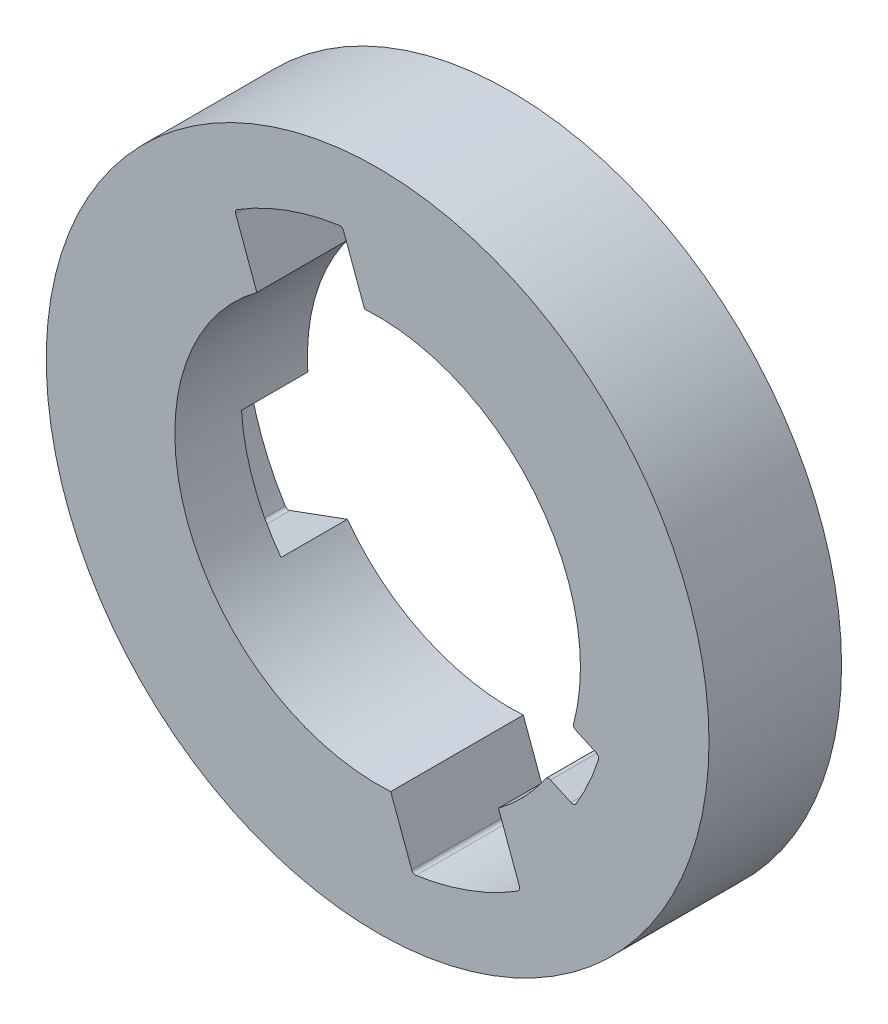
ISO-10303-21;
HEADER;
FILE_DESCRIPTION(('STEP AP214'),'2;1');
FILE_NAME('part.step','',(''),(''),'','','');
FILE_SCHEMA(('AUTOMOTIVE_DESIGN { 1 0 10303 214 1 1 1 1 }'));
ENDSEC;
DATA;
#1=APPLICATION_CONTEXT('core data for automotive mechanical design processes');
#2=APPLICATION_PROTOCOL_DEFINITION('international standard','automotive_design',2000,#1);
#3=PRODUCT_CONTEXT('',#1,'mechanical');
#4=PRODUCT('Part','Part','',(#3));
#5=PRODUCT_RELATED_PRODUCT_CATEGORY('part','',(#4));
#6=PRODUCT_DEFINITION_FORMATION('','',#4);
#7=PRODUCT_DEFINITION_CONTEXT('part definition',#1,'design');
#8=PRODUCT_DEFINITION('design','',#6,#7);
#9=PRODUCT_DEFINITION_SHAPE('','',#8);
#10=(LENGTH_UNIT() NAMED_UNIT(*) SI_UNIT(.MILLI.,.METRE.));
#11=(NAMED_UNIT(*) PLANE_ANGLE_UNIT() SI_UNIT($,.RADIAN.));
#12=(NAMED_UNIT(*) SI_UNIT($,.STERADIAN.) SOLID_ANGLE_UNIT());
#13=UNCERTAINTY_MEASURE_WITH_UNIT(LENGTH_MEASURE(1.E-05),#10,'distance_accuracy_value','');
#14=(GEOMETRIC_REPRESENTATION_CONTEXT(3) GLOBAL_UNCERTAINTY_ASSIGNED_CONTEXT((#13)) GLOBAL_UNIT_ASSIGNED_CONTEXT((#10,
#11,#12)) REPRESENTATION_CONTEXT('',''));
#15=CARTESIAN_POINT('',(0.,0.,0.));
#16=DIRECTION('',(0.,0.,1.));
#17=DIRECTION('',(1.,0.,0.));
#18=AXIS2_PLACEMENT_3D('',#15,#16,#17);
#19=CARTESIAN_POINT('',(0.,0.,10.));
#20=DIRECTION('',(0.,0.,-1.));
#21=DIRECTION('',(-1.,0.,0.));
#22=AXIS2_PLACEMENT_3D('',#19,#20,#21);
#23=CYLINDRICAL_SURFACE('',#22,15.3);
#24=DIRECTION('',(0.,0.,-1.));
#25=VECTOR('',#24,1.);
#26=CARTESIAN_POINT('',(12.2878994904702,9.11578444853222,5.));
#27=LINE('',#26,#25);
#28=CARTESIAN_POINT('',(12.2878994904702,9.11578444853222,5.));
#29=VERTEX_POINT('',#28);
#30=CARTESIAN_POINT('',(12.2878994904702,9.11578444853222,0.));
#31=VERTEX_POINT('',#30);
#32=EDGE_CURVE('E329',#29,#31,#27,.T.);
#33=ORIENTED_EDGE('',*,*,#32,.F.);
#34=CARTESIAN_POINT('',(0.,0.,5.));
#35=DIRECTION('',(0.,0.,1.));
#36=DIRECTION('',(1.,0.,0.));
#37=AXIS2_PLACEMENT_3D('',#34,#35,#36);
#38=CIRCLE('',#37,15.3);
#39=CARTESIAN_POINT('',(15.2681112245238,0.987309290734331,5.));
#40=VERTEX_POINT('',#39);
#41=EDGE_CURVE('E303',#29,#40,#38,.F.);
#42=ORIENTED_EDGE('',*,*,#41,.T.);
#43=DIRECTION('',(0.,0.,-1.));
#44=VECTOR('',#43,1.);
#45=CARTESIAN_POINT('',(15.2681112245238,0.987309290734331,5.));
#46=LINE('',#45,#44);
#47=CARTESIAN_POINT('',(15.2681112245238,0.987309290734331,0.));
#48=VERTEX_POINT('',#47);
#49=EDGE_CURVE('E326',#40,#48,#46,.T.);
#50=ORIENTED_EDGE('',*,*,#49,.T.);
#51=CARTESIAN_POINT('',(0.,0.,0.));
#52=DIRECTION('',(0.,0.,1.));
#53=DIRECTION('',(1.,0.,0.));
#54=AXIS2_PLACEMENT_3D('',#51,#52,#53);
#55=CIRCLE('',#54,15.3);
#56=CARTESIAN_POINT('',(14.7874090005765,-3.92715355565187,0.));
#57=VERTEX_POINT('',#56);
#58=EDGE_CURVE('E409',#48,#57,#55,.F.);
#59=ORIENTED_EDGE('',*,*,#58,.T.);
#60=DIRECTION('',(0.,0.,-1.));
#61=VECTOR('',#60,1.);
#62=CARTESIAN_POINT('',(14.7874090005765,-3.92715355565187,10.));
#63=LINE('',#62,#61);
#64=CARTESIAN_POINT('',(14.7874090005765,-3.92715355565187,10.));
#65=VERTEX_POINT('',#64);
#66=EDGE_CURVE('E474',#65,#57,#63,.T.);
#67=ORIENTED_EDGE('',*,*,#66,.F.);
#68=CARTESIAN_POINT('',(0.,0.,10.));
#69=DIRECTION('',(0.,0.,1.));
#70=DIRECTION('',(1.,0.,0.));
#71=AXIS2_PLACEMENT_3D('',#68,#69,#70);
#72=CIRCLE('',#71,15.3);
#73=CARTESIAN_POINT('',(-0.987309290714909,15.2681112245253,10.));
#74=VERTEX_POINT('',#73);
#75=EDGE_CURVE('E341',#74,#65,#72,.F.);
#76=ORIENTED_EDGE('',*,*,#75,.F.);
#77=DIRECTION('',(0.,0.,-1.));
#78=VECTOR('',#77,1.);
#79=CARTESIAN_POINT('',(-0.987309290714909,15.2681112245253,10.));
#80=LINE('',#79,#78);
#81=CARTESIAN_POINT('',(-0.987309290714909,15.2681112245253,0.));
#82=VERTEX_POINT('',#81);
#83=EDGE_CURVE('E477',#74,#82,#80,.T.);
#84=ORIENTED_EDGE('',*,*,#83,.T.);
#85=EDGE_CURVE('E395',#82,#31,#55,.F.);
#86=ORIENTED_EDGE('',*,*,#85,.T.);
#87=EDGE_LOOP('',(#33,#42,#50,#59,#67,#76,#84,#86));
#88=FACE_BOUND('',#87,.T.);
#89=ADVANCED_FACE('F35',(#88),#23,.F.);
#90=CARTESIAN_POINT('',(0.,0.,0.));
#91=DIRECTION('',(0.,0.,1.));
#92=DIRECTION('',(1.,0.,0.));
#93=AXIS2_PLACEMENT_3D('',#90,#91,#92);
#94=PLANE('',#93);
#95=CARTESIAN_POINT('',(0.,0.,0.));
#96=DIRECTION('',(0.,0.,1.));
#97=DIRECTION('',(1.,0.,0.));
#98=AXIS2_PLACEMENT_3D('',#95,#96,#97);
#99=CIRCLE('',#98,25.);
#100=CARTESIAN_POINT('',(25.,0.,0.));
#101=VERTEX_POINT('',#100);
#102=EDGE_CURVE('E339',#101,#101,#99,.T.);
#103=ORIENTED_EDGE('',*,*,#102,.F.);
#104=EDGE_LOOP('',(#103));
#105=FACE_BOUND('',#104,.T.);
#106=CARTESIAN_POINT('',(-15.2681112245249,-0.9873092907214,0.));
#107=VERTEX_POINT('',#106);
#108=CARTESIAN_POINT('',(-9.1157844485167,12.287899490482,0.));
#109=VERTEX_POINT('',#108);
#110=EDGE_CURVE('E335',#107,#109,#55,.F.);
#111=ORIENTED_EDGE('',*,*,#110,.F.);
#112=DIRECTION('',(0.938884870692142,0.34423131697363,0.));
#113=VECTOR('',#112,1.);
#114=CARTESIAN_POINT('',(-1.49010586702489,4.06423757890232,0.));
#115=LINE('',#114,#113);
#116=CARTESIAN_POINT('',(-19.5952252029292,-2.57379575991228,0.));
#117=VERTEX_POINT('',#116);
#118=EDGE_CURVE('E279',#117,#107,#115,.T.);
#119=ORIENTED_EDGE('',*,*,#118,.F.);
#120=CARTESIAN_POINT('',(-19.4919558078371,-2.85546122111992,0.));
#121=DIRECTION('',(0.,0.,1.));
#122=DIRECTION('',(1.,0.,0.));
#123=AXIS2_PLACEMENT_3D('',#120,#121,#122);
#124=CIRCLE('',#123,0.300000000000003);
#125=CARTESIAN_POINT('',(-19.7887876221696,-2.8989454021522,0.));
#126=VERTEX_POINT('',#125);
#127=EDGE_CURVE('E252',#117,#126,#124,.T.);
#128=ORIENTED_EDGE('',*,*,#127,.T.);
#129=CARTESIAN_POINT('',(0.,0.,0.));
#130=DIRECTION('',(0.,0.,1.));
#131=DIRECTION('',(1.,0.,0.));
#132=AXIS2_PLACEMENT_3D('',#129,#130,#131);
#133=CIRCLE('',#132,19.9999999999998);
#134=CARTESIAN_POINT('',(-16.9728760040347,-10.5792948797005,0.));
#135=VERTEX_POINT('',#134);
#136=EDGE_CURVE('E282',#126,#135,#133,.T.);
#137=ORIENTED_EDGE('',*,*,#136,.T.);
#138=CARTESIAN_POINT('',(-16.7182828639741,-10.420605456505,0.));
#139=DIRECTION('',(0.,0.,1.));
#140=DIRECTION('',(1.,0.,0.));
#141=AXIS2_PLACEMENT_3D('',#138,#139,#140);
#142=CIRCLE('',#141,0.299999999999999);
#143=CARTESIAN_POINT('',(-16.6150134688821,-10.7022709177127,0.));
#144=VERTEX_POINT('',#143);
#145=EDGE_CURVE('E269',#135,#144,#142,.T.);
#146=ORIENTED_EDGE('',*,*,#145,.T.);
#147=DIRECTION('',(0.938884870692142,0.344231316973632,0.));
#148=VECTOR('',#147,1.);
#149=CARTESIAN_POINT('',(1.4901058670232,-4.0642375788977,0.));
#150=LINE('',#149,#148);
#151=CARTESIAN_POINT('',(-12.2878994904782,-9.11578444852193,0.));
#152=VERTEX_POINT('',#151);
#153=EDGE_CURVE('E266',#144,#152,#150,.T.);
#154=ORIENTED_EDGE('',*,*,#153,.T.);
#155=CARTESIAN_POINT('',(0.987309290727881,-15.2681112245245,0.));
#156=VERTEX_POINT('',#155);
#157=EDGE_CURVE('E391',#156,#152,#55,.F.);
#158=ORIENTED_EDGE('',*,*,#157,.F.);
#159=DIRECTION('',(-0.344231316974031,0.938884870691995,0.));
#160=VECTOR('',#159,1.);
#161=CARTESIAN_POINT('',(-4.06423757890171,-1.49010586702663,0.));
#162=LINE('',#161,#160);
#163=CARTESIAN_POINT('',(2.57379575992061,-19.5952252029281,0.));
#164=VERTEX_POINT('',#163);
#165=EDGE_CURVE('E443',#164,#156,#162,.T.);
#166=ORIENTED_EDGE('',*,*,#165,.F.);
#167=CARTESIAN_POINT('',(2.85546122112821,-19.4919558078359,0.));
#168=DIRECTION('',(0.,0.,1.));
#169=DIRECTION('',(1.,0.,0.));
#170=AXIS2_PLACEMENT_3D('',#167,#168,#169);
#171=CIRCLE('',#170,0.300000000000002);
#172=CARTESIAN_POINT('',(2.89894540216061,-19.7887876221684,0.));
#173=VERTEX_POINT('',#172);
#174=EDGE_CURVE('E440',#164,#173,#171,.T.);
#175=ORIENTED_EDGE('',*,*,#174,.T.);
#176=CARTESIAN_POINT('',(0.,0.,0.));
#177=DIRECTION('',(0.,0.,1.));
#178=DIRECTION('',(1.,0.,0.));
#179=AXIS2_PLACEMENT_3D('',#176,#177,#178);
#180=CIRCLE('',#179,19.9999999999998);
#181=CARTESIAN_POINT('',(10.5792948797077,-16.9728760040302,0.));
#182=VERTEX_POINT('',#181);
#183=EDGE_CURVE('E437',#173,#182,#180,.T.);
#184=ORIENTED_EDGE('',*,*,#183,.T.);
#185=CARTESIAN_POINT('',(10.4206054565121,-16.7182828639697,0.));
#186=DIRECTION('',(0.,0.,1.));
#187=DIRECTION('',(1.,0.,0.));
#188=AXIS2_PLACEMENT_3D('',#185,#186,#187);
#189=CIRCLE('',#188,0.299999999999998);
#190=CARTESIAN_POINT('',(10.7022709177197,-16.6150134688775,0.));
#191=VERTEX_POINT('',#190);
#192=EDGE_CURVE('E434',#182,#191,#189,.T.);
#193=ORIENTED_EDGE('',*,*,#192,.T.);
#194=DIRECTION('',(-0.344231316974033,0.938884870691994,0.));
#195=VECTOR('',#194,1.);
#196=CARTESIAN_POINT('',(4.06423757889701,1.49010586702492,0.));
#197=LINE('',#196,#195);
#198=CARTESIAN_POINT('',(9.11578444852714,-12.2878994904743,0.));
#199=VERTEX_POINT('',#198);
#200=EDGE_CURVE('E431',#191,#199,#197,.T.);
#201=ORIENTED_EDGE('',*,*,#200,.T.);
#202=CARTESIAN_POINT('',(12.665533257958,-8.58337155735204,0.));
#203=VERTEX_POINT('',#202);
#204=EDGE_CURVE('E430',#203,#199,#55,.F.);
#205=ORIENTED_EDGE('',*,*,#204,.F.);
#206=CARTESIAN_POINT('',(12.9138770473297,-8.75167296043737,0.));
#207=DIRECTION('',(0.,0.,1.));
#208=DIRECTION('',(1.,0.,0.));
#209=AXIS2_PLACEMENT_3D('',#206,#207,#208);
#210=CIRCLE('',#209,0.299999999999978);
#211=CARTESIAN_POINT('',(13.0382821076452,-8.47868325189895,0.));
#212=VERTEX_POINT('',#211);
#213=EDGE_CURVE('E428',#212,#203,#210,.T.);
#214=ORIENTED_EDGE('',*,*,#213,.F.);
#215=DIRECTION('',(0.909965695128121,-0.414683534384953,0.));
#216=VECTOR('',#215,1.);
#217=CARTESIAN_POINT('',(-0.957317670144075,-2.10070129855316,0.));
#218=LINE('',#217,#216);
#219=CARTESIAN_POINT('',(14.587009396696,-9.18445898549033,0.));
#220=VERTEX_POINT('',#219);
#221=EDGE_CURVE('E425',#212,#220,#218,.T.);
#222=ORIENTED_EDGE('',*,*,#221,.T.);
#223=CARTESIAN_POINT('',(14.7114144570115,-8.9114692769519,0.));
#224=DIRECTION('',(0.,0.,1.));
#225=DIRECTION('',(1.,0.,0.));
#226=AXIS2_PLACEMENT_3D('',#223,#224,#225);
#227=CIRCLE('',#226,0.300000000000002);
#228=CARTESIAN_POINT('',(14.9680088952152,-9.06690188061965,0.));
#229=VERTEX_POINT('',#228);
#230=EDGE_CURVE('E422',#220,#229,#227,.T.);
#231=ORIENTED_EDGE('',*,*,#230,.T.);
#232=CARTESIAN_POINT('',(0.,0.,0.));
#233=DIRECTION('',(0.,0.,1.));
#234=DIRECTION('',(1.,0.,0.));
#235=AXIS2_PLACEMENT_3D('',#232,#233,#234);
#236=CIRCLE('',#235,17.5000000000007);
#237=CARTESIAN_POINT('',(16.6630833285651,-5.34711641778289,0.));
#238=VERTEX_POINT('',#237);
#239=EDGE_CURVE('E419',#238,#229,#236,.F.);
#240=ORIENTED_EDGE('',*,*,#239,.F.);
#241=CARTESIAN_POINT('',(16.3774304715039,-5.25545156490662,0.));
#242=DIRECTION('',(0.,0.,1.));
#243=DIRECTION('',(1.,0.,0.));
#244=AXIS2_PLACEMENT_3D('',#241,#242,#243);
#245=CIRCLE('',#244,0.300000000000005);
#246=CARTESIAN_POINT('',(16.5017580420238,-4.98242655651243,0.));
#247=VERTEX_POINT('',#246);
#248=EDGE_CURVE('E416',#238,#247,#245,.T.);
#249=ORIENTED_EDGE('',*,*,#248,.T.);
#250=DIRECTION('',(0.91008336131394,-0.414425235066013,0.));
#251=VECTOR('',#250,1.);
#252=CARTESIAN_POINT('',(0.954968957555096,2.09712460850453,0.));
#253=LINE('',#252,#251);
#254=CARTESIAN_POINT('',(14.9530306261464,-4.27718157494119,0.));
#255=VERTEX_POINT('',#254);
#256=EDGE_CURVE('E413',#255,#247,#253,.T.);
#257=ORIENTED_EDGE('',*,*,#256,.F.);
#258=CARTESIAN_POINT('',(15.0773581966662,-4.00415656654701,0.));
#259=DIRECTION('',(0.,0.,1.));
#260=DIRECTION('',(1.,0.,0.));
#261=AXIS2_PLACEMENT_3D('',#258,#259,#260);
#262=CIRCLE('',#261,0.3);
#263=EDGE_CURVE('E410',#255,#57,#262,.F.);
#264=ORIENTED_EDGE('',*,*,#263,.T.);
#265=ORIENTED_EDGE('',*,*,#58,.F.);
#266=DIRECTION('',(-0.938884870691849,-0.34423131697443,0.));
#267=VECTOR('',#266,1.);
#268=CARTESIAN_POINT('',(1.49010586702835,-4.06423757890104,0.));
#269=LINE('',#268,#267);
#270=CARTESIAN_POINT('',(19.5952252029267,2.5737957599289,0.));
#271=VERTEX_POINT('',#270);
#272=EDGE_CURVE('E319',#271,#48,#269,.T.);
#273=ORIENTED_EDGE('',*,*,#272,.F.);
#274=CARTESIAN_POINT('',(19.4919558078344,2.85546122113646,0.));
#275=DIRECTION('',(0.,0.,1.));
#276=DIRECTION('',(1.,0.,0.));
#277=AXIS2_PLACEMENT_3D('',#274,#275,#276);
#278=CIRCLE('',#277,0.300000000000003);
#279=CARTESIAN_POINT('',(19.7887876221669,2.89894540216899,0.));
#280=VERTEX_POINT('',#279);
#281=EDGE_CURVE('E299',#271,#280,#278,.T.);
#282=ORIENTED_EDGE('',*,*,#281,.T.);
#283=CARTESIAN_POINT('',(0.,0.,0.));
#284=DIRECTION('',(0.,0.,1.));
#285=DIRECTION('',(1.,0.,0.));
#286=AXIS2_PLACEMENT_3D('',#283,#284,#285);
#287=CIRCLE('',#286,19.9999999999996);
#288=CARTESIAN_POINT('',(16.9728760040255,10.5792948797148,0.));
#289=VERTEX_POINT('',#288);
#290=EDGE_CURVE('E58',#280,#289,#287,.T.);
#291=ORIENTED_EDGE('',*,*,#290,.T.);
#292=CARTESIAN_POINT('',(16.7182828639651,10.4206054565191,0.));
#293=DIRECTION('',(0.,0.,1.));
#294=DIRECTION('',(1.,0.,0.));
#295=AXIS2_PLACEMENT_3D('',#292,#293,#294);
#296=CIRCLE('',#295,0.299999999999999);
#297=CARTESIAN_POINT('',(16.6150134688727,10.7022709177266,0.));
#298=VERTEX_POINT('',#297);
#299=EDGE_CURVE('E313',#289,#298,#296,.T.);
#300=ORIENTED_EDGE('',*,*,#299,.T.);
#301=DIRECTION('',(-0.938884870691849,-0.344231316974429,0.));
#302=VECTOR('',#301,1.);
#303=CARTESIAN_POINT('',(-1.49010586702663,4.06423757889636,0.));
#304=LINE('',#303,#302);
#305=EDGE_CURVE('E316',#298,#31,#304,.T.);
#306=ORIENTED_EDGE('',*,*,#305,.T.);
#307=ORIENTED_EDGE('',*,*,#85,.F.);
#308=DIRECTION('',(0.344231316973231,-0.938884870692288,0.));
#309=VECTOR('',#308,1.);
#310=CARTESIAN_POINT('',(4.06423757890296,1.49010586702316,0.));
#311=LINE('',#310,#309);
#312=CARTESIAN_POINT('',(-2.57379575990395,19.5952252029303,0.));
#313=VERTEX_POINT('',#312);
#314=EDGE_CURVE('E407',#313,#82,#311,.T.);
#315=ORIENTED_EDGE('',*,*,#314,.F.);
#316=CARTESIAN_POINT('',(-2.85546122111164,19.4919558078383,0.));
#317=DIRECTION('',(0.,0.,1.));
#318=DIRECTION('',(1.,0.,0.));
#319=AXIS2_PLACEMENT_3D('',#316,#317,#318);
#320=CIRCLE('',#319,0.300000000000002);
#321=CARTESIAN_POINT('',(-2.8989454021438,19.7887876221709,0.));
#322=VERTEX_POINT('',#321);
#323=EDGE_CURVE('E404',#313,#322,#320,.T.);
#324=ORIENTED_EDGE('',*,*,#323,.T.);
#325=CARTESIAN_POINT('',(0.,0.,0.));
#326=DIRECTION('',(0.,0.,1.));
#327=DIRECTION('',(1.,0.,0.));
#328=AXIS2_PLACEMENT_3D('',#325,#326,#327);
#329=CIRCLE('',#328,19.9999999999998);
#330=CARTESIAN_POINT('',(-10.5792948796933,16.9728760040392,0.));
#331=VERTEX_POINT('',#330);
#332=EDGE_CURVE('E401',#322,#331,#329,.T.);
#333=ORIENTED_EDGE('',*,*,#332,.T.);
#334=CARTESIAN_POINT('',(-10.4206054564979,16.7182828639786,0.));
#335=DIRECTION('',(0.,0.,1.));
#336=DIRECTION('',(1.,0.,0.));
#337=AXIS2_PLACEMENT_3D('',#334,#335,#336);
#338=CIRCLE('',#337,0.299999999999995);
#339=CARTESIAN_POINT('',(-10.7022709177056,16.6150134688866,0.));
#340=VERTEX_POINT('',#339);
#341=EDGE_CURVE('E398',#331,#340,#338,.T.);
#342=ORIENTED_EDGE('',*,*,#341,.T.);
#343=DIRECTION('',(0.344231316973233,-0.938884870692288,0.));
#344=VECTOR('',#343,1.);
#345=CARTESIAN_POINT('',(-4.06423757889832,-1.49010586702147,0.));
#346=LINE('',#345,#344);
#347=EDGE_CURVE('E394',#340,#109,#346,.T.);
#348=ORIENTED_EDGE('',*,*,#347,.T.);
#349=EDGE_LOOP('',(#111,#119,#128,#137,#146,#154,#158,#166,#175,#184,#193,#201,#205,#214,#222,
#231,#240,#249,#257,#264,#265,#273,#282,#291,#300,#306,#307,#315,#324,#333,#342,#348));
#350=FACE_BOUND('',#349,.T.);
#351=ADVANCED_FACE('F495',(#105,#350),#94,.F.);
#352=CARTESIAN_POINT('',(0.,0.,5.));
#353=DIRECTION('',(0.,0.,1.));
#354=DIRECTION('',(1.,0.,0.));
#355=AXIS2_PLACEMENT_3D('',#352,#353,#354);
#356=CIRCLE('',#355,15.3);
#357=CARTESIAN_POINT('',(-12.2878994904782,-9.11578444852193,5.));
#358=VERTEX_POINT('',#357);
#359=CARTESIAN_POINT('',(-15.2681112245246,-0.987309290721305,5.));
#360=VERTEX_POINT('',#359);
#361=EDGE_CURVE('E277',#358,#360,#356,.F.);
#362=ORIENTED_EDGE('',*,*,#361,.T.);
#363=DIRECTION('',(0.,0.,-1.));
#364=VECTOR('',#363,1.);
#365=CARTESIAN_POINT('',(-15.2681112245249,-0.9873092907214,5.));
#366=LINE('',#365,#364);
#367=EDGE_CURVE('E264',#360,#107,#366,.T.);
#368=ORIENTED_EDGE('',*,*,#367,.T.);
#369=ORIENTED_EDGE('',*,*,#110,.T.);
#370=DIRECTION('',(0.,0.,-1.));
#371=VECTOR('',#370,1.);
#372=CARTESIAN_POINT('',(-9.1157844485167,12.287899490482,10.));
#373=LINE('',#372,#371);
#374=CARTESIAN_POINT('',(-9.1157844485167,12.287899490482,10.));
#375=VERTEX_POINT('',#374);
#376=EDGE_CURVE('E11',#375,#109,#373,.T.);
#377=ORIENTED_EDGE('',*,*,#376,.F.);
#378=CARTESIAN_POINT('',(0.987309290727881,-15.2681112245245,10.));
#379=VERTEX_POINT('',#378);
#380=EDGE_CURVE('E336',#379,#375,#72,.F.);
#381=ORIENTED_EDGE('',*,*,#380,.F.);
#382=DIRECTION('',(0.,0.,-1.));
#383=VECTOR('',#382,1.);
#384=CARTESIAN_POINT('',(0.987309290727881,-15.2681112245245,10.));
#385=LINE('',#384,#383);
#386=EDGE_CURVE('E390',#379,#156,#385,.T.);
#387=ORIENTED_EDGE('',*,*,#386,.T.);
#388=ORIENTED_EDGE('',*,*,#157,.T.);
#389=DIRECTION('',(0.,0.,-1.));
#390=VECTOR('',#389,1.);
#391=CARTESIAN_POINT('',(-12.2878994904782,-9.11578444852193,5.));
#392=LINE('',#391,#390);
#393=EDGE_CURVE('E288',#358,#152,#392,.T.);
#394=ORIENTED_EDGE('',*,*,#393,.F.);
#395=EDGE_LOOP('',(#362,#368,#369,#377,#381,#387,#388,#394));
#396=FACE_BOUND('',#395,.T.);
#397=ADVANCED_FACE('F511',(#396),#23,.F.);
#398=CARTESIAN_POINT('',(-4.06423757889832,-1.49010586702147,10.));
#399=DIRECTION('',(0.938884870692288,0.344231316973233,0.));
#400=DIRECTION('',(-0.344231316973233,0.938884870692288,0.));
#401=AXIS2_PLACEMENT_3D('',#398,#399,#400);
#402=PLANE('',#401);
#403=ORIENTED_EDGE('',*,*,#347,.F.);
#404=DIRECTION('',(0.,0.,-1.));
#405=VECTOR('',#404,1.);
#406=CARTESIAN_POINT('',(-10.7022709177056,16.6150134688866,10.));
#407=LINE('',#406,#405);
#408=CARTESIAN_POINT('',(-10.7022709177056,16.6150134688866,10.));
#409=VERTEX_POINT('',#408);
#410=EDGE_CURVE('E43',#409,#340,#407,.T.);
#411=ORIENTED_EDGE('',*,*,#410,.F.);
#412=DIRECTION('',(0.344231316973233,-0.938884870692288,0.));
#413=VECTOR('',#412,1.);
#414=CARTESIAN_POINT('',(-4.06423757889832,-1.49010586702147,10.));
#415=LINE('',#414,#413);
#416=EDGE_CURVE('E338',#409,#375,#415,.T.);
#417=ORIENTED_EDGE('',*,*,#416,.T.);
#418=ORIENTED_EDGE('',*,*,#376,.T.);
#419=EDGE_LOOP('',(#403,#411,#417,#418));
#420=FACE_BOUND('',#419,.T.);
#421=ADVANCED_FACE('F37',(#420),#402,.T.);
#422=CARTESIAN_POINT('',(-10.4206054564979,16.7182828639786,10.));
#423=DIRECTION('',(0.,0.,-1.));
#424=DIRECTION('',(-1.,0.,0.));
#425=AXIS2_PLACEMENT_3D('',#422,#423,#424);
#426=CYLINDRICAL_SURFACE('',#425,0.299999999999995);
#427=ORIENTED_EDGE('',*,*,#341,.F.);
#428=DIRECTION('',(0.,0.,-1.));
#429=VECTOR('',#428,1.);
#430=CARTESIAN_POINT('',(-10.5792948796933,16.9728760040392,10.));
#431=LINE('',#430,#429);
#432=CARTESIAN_POINT('',(-10.5792948796933,16.9728760040392,10.));
#433=VERTEX_POINT('',#432);
#434=EDGE_CURVE('E484',#433,#331,#431,.T.);
#435=ORIENTED_EDGE('',*,*,#434,.F.);
#436=CARTESIAN_POINT('',(-10.4206054564979,16.7182828639786,10.));
#437=DIRECTION('',(0.,0.,1.));
#438=DIRECTION('',(1.,0.,0.));
#439=AXIS2_PLACEMENT_3D('',#436,#437,#438);
#440=CIRCLE('',#439,0.299999999999995);
#441=EDGE_CURVE('E344',#433,#409,#440,.T.);
#442=ORIENTED_EDGE('',*,*,#441,.T.);
#443=ORIENTED_EDGE('',*,*,#410,.T.);
#444=EDGE_LOOP('',(#427,#435,#442,#443));
#445=FACE_BOUND('',#444,.T.);
#446=ADVANCED_FACE('F488',(#445),#426,.F.);
#447=CARTESIAN_POINT('',(0.,0.,10.));
#448=DIRECTION('',(0.,0.,-1.));
#449=DIRECTION('',(-1.,0.,0.));
#450=AXIS2_PLACEMENT_3D('',#447,#448,#449);
#451=CYLINDRICAL_SURFACE('',#450,19.9999999999998);
#452=ORIENTED_EDGE('',*,*,#332,.F.);
#453=DIRECTION('',(0.,0.,-1.));
#454=VECTOR('',#453,1.);
#455=CARTESIAN_POINT('',(-2.8989454021438,19.7887876221709,10.));
#456=LINE('',#455,#454);
#457=CARTESIAN_POINT('',(-2.8989454021438,19.7887876221709,10.));
#458=VERTEX_POINT('',#457);
#459=EDGE_CURVE('E482',#458,#322,#456,.T.);
#460=ORIENTED_EDGE('',*,*,#459,.F.);
#461=CARTESIAN_POINT('',(0.,0.,10.));
#462=DIRECTION('',(0.,0.,1.));
#463=DIRECTION('',(1.,0.,0.));
#464=AXIS2_PLACEMENT_3D('',#461,#462,#463);
#465=CIRCLE('',#464,19.9999999999998);
#466=EDGE_CURVE('E347',#458,#433,#465,.T.);
#467=ORIENTED_EDGE('',*,*,#466,.T.);
#468=ORIENTED_EDGE('',*,*,#434,.T.);
#469=EDGE_LOOP('',(#452,#460,#467,#468));
#470=FACE_BOUND('',#469,.T.);
#471=ADVANCED_FACE('F500',(#470),#451,.F.);
#472=CARTESIAN_POINT('',(-2.85546122111164,19.4919558078383,10.));
#473=DIRECTION('',(0.,0.,-1.));
#474=DIRECTION('',(-1.,0.,0.));
#475=AXIS2_PLACEMENT_3D('',#472,#473,#474);
#476=CYLINDRICAL_SURFACE('',#475,0.300000000000002);
#477=ORIENTED_EDGE('',*,*,#323,.F.);
#478=DIRECTION('',(0.,0.,-1.));
#479=VECTOR('',#478,1.);
#480=CARTESIAN_POINT('',(-2.57379575990395,19.5952252029303,10.));
#481=LINE('',#480,#479);
#482=CARTESIAN_POINT('',(-2.57379575990395,19.5952252029303,10.));
#483=VERTEX_POINT('',#482);
#484=EDGE_CURVE('E480',#483,#313,#481,.T.);
#485=ORIENTED_EDGE('',*,*,#484,.F.);
#486=CARTESIAN_POINT('',(-2.85546122111164,19.4919558078383,10.));
#487=DIRECTION('',(0.,0.,1.));
#488=DIRECTION('',(1.,0.,0.));
#489=AXIS2_PLACEMENT_3D('',#486,#487,#488);
#490=CIRCLE('',#489,0.300000000000002);
#491=EDGE_CURVE('E350',#483,#458,#490,.T.);
#492=ORIENTED_EDGE('',*,*,#491,.T.);
#493=ORIENTED_EDGE('',*,*,#459,.T.);
#494=EDGE_LOOP('',(#477,#485,#492,#493));
#495=FACE_BOUND('',#494,.T.);
#496=ADVANCED_FACE('F612',(#495),#476,.F.);
#497=CARTESIAN_POINT('',(4.06423757890296,1.49010586702316,10.));
#498=DIRECTION('',(0.938884870692288,0.344231316973231,0.));
#499=DIRECTION('',(-0.344231316973231,0.938884870692288,0.));
#500=AXIS2_PLACEMENT_3D('',#497,#498,#499);
#501=PLANE('',#500);
#502=ORIENTED_EDGE('',*,*,#314,.T.);
#503=ORIENTED_EDGE('',*,*,#83,.F.);
#504=DIRECTION('',(0.344231316973231,-0.938884870692288,0.));
#505=VECTOR('',#504,1.);
#506=CARTESIAN_POINT('',(4.06423757890296,1.49010586702316,10.));
#507=LINE('',#506,#505);
#508=EDGE_CURVE('E353',#483,#74,#507,.T.);
#509=ORIENTED_EDGE('',*,*,#508,.F.);
#510=ORIENTED_EDGE('',*,*,#484,.T.);
#511=EDGE_LOOP('',(#502,#503,#509,#510));
#512=FACE_BOUND('',#511,.T.);
#513=ADVANCED_FACE('F608',(#512),#501,.F.);
#514=CARTESIAN_POINT('',(15.0773581966662,-4.00415656654701,10.));
#515=DIRECTION('',(0.,0.,-1.));
#516=DIRECTION('',(-1.,0.,0.));
#517=AXIS2_PLACEMENT_3D('',#514,#515,#516);
#518=CYLINDRICAL_SURFACE('',#517,0.3);
#519=ORIENTED_EDGE('',*,*,#263,.F.);
#520=DIRECTION('',(0.,0.,-1.));
#521=VECTOR('',#520,1.);
#522=CARTESIAN_POINT('',(14.9530306261464,-4.27718157494119,10.));
#523=LINE('',#522,#521);
#524=CARTESIAN_POINT('',(14.9530306261464,-4.27718157494119,10.));
#525=VERTEX_POINT('',#524);
#526=EDGE_CURVE('E472',#525,#255,#523,.T.);
#527=ORIENTED_EDGE('',*,*,#526,.F.);
#528=CARTESIAN_POINT('',(15.0773581966662,-4.00415656654701,10.));
#529=DIRECTION('',(0.,0.,1.));
#530=DIRECTION('',(1.,0.,0.));
#531=AXIS2_PLACEMENT_3D('',#528,#529,#530);
#532=CIRCLE('',#531,0.3);
#533=EDGE_CURVE('E355',#525,#65,#532,.F.);
#534=ORIENTED_EDGE('',*,*,#533,.T.);
#535=ORIENTED_EDGE('',*,*,#66,.T.);
#536=EDGE_LOOP('',(#519,#527,#534,#535));
#537=FACE_BOUND('',#536,.T.);
#538=ADVANCED_FACE('F604',(#537),#518,.T.);
#539=CARTESIAN_POINT('',(0.954968957555096,2.09712460850453,10.));
#540=DIRECTION('',(0.414425235066013,0.91008336131394,0.));
#541=DIRECTION('',(-0.91008336131394,0.414425235066013,0.));
#542=AXIS2_PLACEMENT_3D('',#539,#540,#541);
#543=PLANE('',#542);
#544=ORIENTED_EDGE('',*,*,#256,.T.);
#545=DIRECTION('',(0.,0.,-1.));
#546=VECTOR('',#545,1.);
#547=CARTESIAN_POINT('',(16.5017580420238,-4.98242655651243,10.));
#548=LINE('',#547,#546);
#549=CARTESIAN_POINT('',(16.5017580420238,-4.98242655651243,10.));
#550=VERTEX_POINT('',#549);
#551=EDGE_CURVE('E470',#550,#247,#548,.T.);
#552=ORIENTED_EDGE('',*,*,#551,.F.);
#553=DIRECTION('',(0.91008336131394,-0.414425235066013,0.));
#554=VECTOR('',#553,1.);
#555=CARTESIAN_POINT('',(0.954968957555096,2.09712460850453,10.));
#556=LINE('',#555,#554);
#557=EDGE_CURVE('E358',#525,#550,#556,.T.);
#558=ORIENTED_EDGE('',*,*,#557,.F.);
#559=ORIENTED_EDGE('',*,*,#526,.T.);
#560=EDGE_LOOP('',(#544,#552,#558,#559));
#561=FACE_BOUND('',#560,.T.);
#562=ADVANCED_FACE('F600',(#561),#543,.F.);
#563=CARTESIAN_POINT('',(16.3774304715039,-5.25545156490662,10.));
#564=DIRECTION('',(0.,0.,-1.));
#565=DIRECTION('',(-1.,0.,0.));
#566=AXIS2_PLACEMENT_3D('',#563,#564,#565);
#567=CYLINDRICAL_SURFACE('',#566,0.300000000000005);
#568=ORIENTED_EDGE('',*,*,#248,.F.);
#569=DIRECTION('',(0.,0.,-1.));
#570=VECTOR('',#569,1.);
#571=CARTESIAN_POINT('',(16.6630833285651,-5.34711641778289,10.));
#572=LINE('',#571,#570);
#573=CARTESIAN_POINT('',(16.6630833285651,-5.34711641778289,10.));
#574=VERTEX_POINT('',#573);
#575=EDGE_CURVE('E468',#574,#238,#572,.T.);
#576=ORIENTED_EDGE('',*,*,#575,.F.);
#577=CARTESIAN_POINT('',(16.3774304715039,-5.25545156490662,10.));
#578=DIRECTION('',(0.,0.,1.));
#579=DIRECTION('',(1.,0.,0.));
#580=AXIS2_PLACEMENT_3D('',#577,#578,#579);
#581=CIRCLE('',#580,0.300000000000005);
#582=EDGE_CURVE('E360',#574,#550,#581,.T.);
#583=ORIENTED_EDGE('',*,*,#582,.T.);
#584=ORIENTED_EDGE('',*,*,#551,.T.);
#585=EDGE_LOOP('',(#568,#576,#583,#584));
#586=FACE_BOUND('',#585,.T.);
#587=ADVANCED_FACE('F596',(#586),#567,.F.);
#588=CARTESIAN_POINT('',(0.,0.,10.));
#589=DIRECTION('',(0.,0.,-1.));
#590=DIRECTION('',(-1.,0.,0.));
#591=AXIS2_PLACEMENT_3D('',#588,#589,#590);
#592=CYLINDRICAL_SURFACE('',#591,17.5000000000007);
#593=ORIENTED_EDGE('',*,*,#239,.T.);
#594=DIRECTION('',(0.,0.,-1.));
#595=VECTOR('',#594,1.);
#596=CARTESIAN_POINT('',(14.9680088952152,-9.06690188061965,10.));
#597=LINE('',#596,#595);
#598=CARTESIAN_POINT('',(14.9680088952152,-9.06690188061965,10.));
#599=VERTEX_POINT('',#598);
#600=EDGE_CURVE('E466',#599,#229,#597,.T.);
#601=ORIENTED_EDGE('',*,*,#600,.F.);
#602=CARTESIAN_POINT('',(0.,0.,10.));
#603=DIRECTION('',(0.,0.,1.));
#604=DIRECTION('',(1.,0.,0.));
#605=AXIS2_PLACEMENT_3D('',#602,#603,#604);
#606=CIRCLE('',#605,17.5000000000007);
#607=EDGE_CURVE('E363',#574,#599,#606,.F.);
#608=ORIENTED_EDGE('',*,*,#607,.F.);
#609=ORIENTED_EDGE('',*,*,#575,.T.);
#610=EDGE_LOOP('',(#593,#601,#608,#609));
#611=FACE_BOUND('',#610,.T.);
#612=ADVANCED_FACE('F592',(#611),#592,.F.);
#613=CARTESIAN_POINT('',(14.7114144570115,-8.9114692769519,10.));
#614=DIRECTION('',(0.,0.,-1.));
#615=DIRECTION('',(-1.,0.,0.));
#616=AXIS2_PLACEMENT_3D('',#613,#614,#615);
#617=CYLINDRICAL_SURFACE('',#616,0.300000000000002);
#618=ORIENTED_EDGE('',*,*,#230,.F.);
#619=DIRECTION('',(0.,0.,-1.));
#620=VECTOR('',#619,1.);
#621=CARTESIAN_POINT('',(14.587009396696,-9.18445898549033,10.));
#622=LINE('',#621,#620);
#623=CARTESIAN_POINT('',(14.587009396696,-9.18445898549033,10.));
#624=VERTEX_POINT('',#623);
#625=EDGE_CURVE('E464',#624,#220,#622,.T.);
#626=ORIENTED_EDGE('',*,*,#625,.F.);
#627=CARTESIAN_POINT('',(14.7114144570115,-8.9114692769519,10.));
#628=DIRECTION('',(0.,0.,1.));
#629=DIRECTION('',(1.,0.,0.));
#630=AXIS2_PLACEMENT_3D('',#627,#628,#629);
#631=CIRCLE('',#630,0.300000000000002);
#632=EDGE_CURVE('E365',#624,#599,#631,.T.);
#633=ORIENTED_EDGE('',*,*,#632,.T.);
#634=ORIENTED_EDGE('',*,*,#600,.T.);
#635=EDGE_LOOP('',(#618,#626,#633,#634));
#636=FACE_BOUND('',#635,.T.);
#637=ADVANCED_FACE('F586',(#636),#617,.F.);
#638=CARTESIAN_POINT('',(-0.957317670144075,-2.10070129855316,10.));
#639=DIRECTION('',(0.414683534384953,0.909965695128121,0.));
#640=DIRECTION('',(-0.909965695128121,0.414683534384953,0.));
#641=AXIS2_PLACEMENT_3D('',#638,#639,#640);
#642=PLANE('',#641);
#643=ORIENTED_EDGE('',*,*,#221,.F.);
#644=DIRECTION('',(0.,0.,-1.));
#645=VECTOR('',#644,1.);
#646=CARTESIAN_POINT('',(13.0382821076452,-8.47868325189895,10.));
#647=LINE('',#646,#645);
#648=CARTESIAN_POINT('',(13.0382821076452,-8.47868325189895,10.));
#649=VERTEX_POINT('',#648);
#650=EDGE_CURVE('E462',#649,#212,#647,.T.);
#651=ORIENTED_EDGE('',*,*,#650,.F.);
#652=DIRECTION('',(0.909965695128121,-0.414683534384953,0.));
#653=VECTOR('',#652,1.);
#654=CARTESIAN_POINT('',(-0.957317670144075,-2.10070129855316,10.));
#655=LINE('',#654,#653);
#656=EDGE_CURVE('E368',#649,#624,#655,.T.);
#657=ORIENTED_EDGE('',*,*,#656,.T.);
#658=ORIENTED_EDGE('',*,*,#625,.T.);
#659=EDGE_LOOP('',(#643,#651,#657,#658));
#660=FACE_BOUND('',#659,.T.);
#661=ADVANCED_FACE('F581',(#660),#642,.T.);
#662=CARTESIAN_POINT('',(12.9138770473297,-8.75167296043737,10.));
#663=DIRECTION('',(0.,0.,-1.));
#664=DIRECTION('',(-1.,0.,0.));
#665=AXIS2_PLACEMENT_3D('',#662,#663,#664);
#666=CYLINDRICAL_SURFACE('',#665,0.299999999999978);
#667=ORIENTED_EDGE('',*,*,#213,.T.);
#668=DIRECTION('',(0.,0.,-1.));
#669=VECTOR('',#668,1.);
#670=CARTESIAN_POINT('',(12.665533257958,-8.58337155735204,10.));
#671=LINE('',#670,#669);
#672=CARTESIAN_POINT('',(12.665533257958,-8.58337155735204,10.));
#673=VERTEX_POINT('',#672);
#674=EDGE_CURVE('E459',#673,#203,#671,.T.);
#675=ORIENTED_EDGE('',*,*,#674,.F.);
#676=CARTESIAN_POINT('',(12.9138770473297,-8.75167296043737,10.));
#677=DIRECTION('',(0.,0.,1.));
#678=DIRECTION('',(1.,0.,0.));
#679=AXIS2_PLACEMENT_3D('',#676,#677,#678);
#680=CIRCLE('',#679,0.299999999999978);
#681=EDGE_CURVE('E371',#649,#673,#680,.T.);
#682=ORIENTED_EDGE('',*,*,#681,.F.);
#683=ORIENTED_EDGE('',*,*,#650,.T.);
#684=EDGE_LOOP('',(#667,#675,#682,#683));
#685=FACE_BOUND('',#684,.T.);
#686=ADVANCED_FACE('F576',(#685),#666,.T.);
#687=ORIENTED_EDGE('',*,*,#204,.T.);
#688=DIRECTION('',(0.,0.,-1.));
#689=VECTOR('',#688,1.);
#690=CARTESIAN_POINT('',(9.11578444852714,-12.2878994904743,10.));
#691=LINE('',#690,#689);
#692=CARTESIAN_POINT('',(9.11578444852714,-12.2878994904743,10.));
#693=VERTEX_POINT('',#692);
#694=EDGE_CURVE('E457',#693,#199,#691,.T.);
#695=ORIENTED_EDGE('',*,*,#694,.F.);
#696=EDGE_CURVE('E340',#673,#693,#72,.F.);
#697=ORIENTED_EDGE('',*,*,#696,.F.);
#698=ORIENTED_EDGE('',*,*,#674,.T.);
#699=EDGE_LOOP('',(#687,#695,#697,#698));
#700=FACE_BOUND('',#699,.T.);
#701=ADVANCED_FACE('F520',(#700),#23,.F.);
#702=CARTESIAN_POINT('',(4.06423757889701,1.49010586702492,10.));
#703=DIRECTION('',(-0.938884870691994,-0.344231316974033,0.));
#704=DIRECTION('',(0.344231316974033,-0.938884870691994,0.));
#705=AXIS2_PLACEMENT_3D('',#702,#703,#704);
#706=PLANE('',#705);
#707=ORIENTED_EDGE('',*,*,#200,.F.);
#708=DIRECTION('',(0.,0.,-1.));
#709=VECTOR('',#708,1.);
#710=CARTESIAN_POINT('',(10.7022709177197,-16.6150134688775,10.));
#711=LINE('',#710,#709);
#712=CARTESIAN_POINT('',(10.7022709177197,-16.6150134688775,10.));
#713=VERTEX_POINT('',#712);
#714=EDGE_CURVE('E455',#713,#191,#711,.T.);
#715=ORIENTED_EDGE('',*,*,#714,.F.);
#716=DIRECTION('',(-0.344231316974033,0.938884870691994,0.));
#717=VECTOR('',#716,1.);
#718=CARTESIAN_POINT('',(4.06423757889701,1.49010586702492,10.));
#719=LINE('',#718,#717);
#720=EDGE_CURVE('E373',#713,#693,#719,.T.);
#721=ORIENTED_EDGE('',*,*,#720,.T.);
#722=ORIENTED_EDGE('',*,*,#694,.T.);
#723=EDGE_LOOP('',(#707,#715,#721,#722));
#724=FACE_BOUND('',#723,.T.);
#725=ADVANCED_FACE('F527',(#724),#706,.T.);
#726=CARTESIAN_POINT('',(10.4206054565121,-16.7182828639697,10.));
#727=DIRECTION('',(0.,0.,-1.));
#728=DIRECTION('',(-1.,0.,0.));
#729=AXIS2_PLACEMENT_3D('',#726,#727,#728);
#730=CYLINDRICAL_SURFACE('',#729,0.299999999999998);
#731=ORIENTED_EDGE('',*,*,#192,.F.);
#732=DIRECTION('',(0.,0.,-1.));
#733=VECTOR('',#732,1.);
#734=CARTESIAN_POINT('',(10.5792948797077,-16.9728760040302,10.));
#735=LINE('',#734,#733);
#736=CARTESIAN_POINT('',(10.5792948797077,-16.9728760040302,10.));
#737=VERTEX_POINT('',#736);
#738=EDGE_CURVE('E453',#737,#182,#735,.T.);
#739=ORIENTED_EDGE('',*,*,#738,.F.);
#740=CARTESIAN_POINT('',(10.4206054565121,-16.7182828639697,10.));
#741=DIRECTION('',(0.,0.,1.));
#742=DIRECTION('',(1.,0.,0.));
#743=AXIS2_PLACEMENT_3D('',#740,#741,#742);
#744=CIRCLE('',#743,0.299999999999998);
#745=EDGE_CURVE('E376',#737,#713,#744,.T.);
#746=ORIENTED_EDGE('',*,*,#745,.T.);
#747=ORIENTED_EDGE('',*,*,#714,.T.);
#748=EDGE_LOOP('',(#731,#739,#746,#747));
#749=FACE_BOUND('',#748,.T.);
#750=ADVANCED_FACE('F532',(#749),#730,.F.);
#751=CARTESIAN_POINT('',(0.,0.,10.));
#752=DIRECTION('',(0.,0.,-1.));
#753=DIRECTION('',(-1.,0.,0.));
#754=AXIS2_PLACEMENT_3D('',#751,#752,#753);
#755=CYLINDRICAL_SURFACE('',#754,19.9999999999998);
#756=ORIENTED_EDGE('',*,*,#183,.F.);
#757=DIRECTION('',(0.,0.,-1.));
#758=VECTOR('',#757,1.);
#759=CARTESIAN_POINT('',(2.89894540216061,-19.7887876221684,10.));
#760=LINE('',#759,#758);
#761=CARTESIAN_POINT('',(2.89894540216061,-19.7887876221684,10.));
#762=VERTEX_POINT('',#761);
#763=EDGE_CURVE('E451',#762,#173,#760,.T.);
#764=ORIENTED_EDGE('',*,*,#763,.F.);
#765=CARTESIAN_POINT('',(0.,0.,10.));
#766=DIRECTION('',(0.,0.,1.));
#767=DIRECTION('',(1.,0.,0.));
#768=AXIS2_PLACEMENT_3D('',#765,#766,#767);
#769=CIRCLE('',#768,19.9999999999998);
#770=EDGE_CURVE('E379',#762,#737,#769,.T.);
#771=ORIENTED_EDGE('',*,*,#770,.T.);
#772=ORIENTED_EDGE('',*,*,#738,.T.);
#773=EDGE_LOOP('',(#756,#764,#771,#772));
#774=FACE_BOUND('',#773,.T.);
#775=ADVANCED_FACE('F535',(#774),#755,.F.);
#776=CARTESIAN_POINT('',(2.85546122112821,-19.4919558078359,10.));
#777=DIRECTION('',(0.,0.,-1.));
#778=DIRECTION('',(-1.,0.,0.));
#779=AXIS2_PLACEMENT_3D('',#776,#777,#778);
#780=CYLINDRICAL_SURFACE('',#779,0.300000000000002);
#781=ORIENTED_EDGE('',*,*,#174,.F.);
#782=DIRECTION('',(0.,0.,-1.));
#783=VECTOR('',#782,1.);
#784=CARTESIAN_POINT('',(2.57379575992061,-19.5952252029281,10.));
#785=LINE('',#784,#783);
#786=CARTESIAN_POINT('',(2.57379575992061,-19.5952252029281,10.));
#787=VERTEX_POINT('',#786);
#788=EDGE_CURVE('E449',#787,#164,#785,.T.);
#789=ORIENTED_EDGE('',*,*,#788,.F.);
#790=CARTESIAN_POINT('',(2.85546122112821,-19.4919558078359,10.));
#791=DIRECTION('',(0.,0.,1.));
#792=DIRECTION('',(1.,0.,0.));
#793=AXIS2_PLACEMENT_3D('',#790,#791,#792);
#794=CIRCLE('',#793,0.300000000000002);
#795=EDGE_CURVE('E382',#787,#762,#794,.T.);
#796=ORIENTED_EDGE('',*,*,#795,.T.);
#797=ORIENTED_EDGE('',*,*,#763,.T.);
#798=EDGE_LOOP('',(#781,#789,#796,#797));
#799=FACE_BOUND('',#798,.T.);
#800=ADVANCED_FACE('F538',(#799),#780,.F.);
#801=CARTESIAN_POINT('',(-4.06423757890171,-1.49010586702663,10.));
#802=DIRECTION('',(-0.938884870691995,-0.344231316974031,0.));
#803=DIRECTION('',(0.344231316974031,-0.938884870691995,0.));
#804=AXIS2_PLACEMENT_3D('',#801,#802,#803);
#805=PLANE('',#804);
#806=ORIENTED_EDGE('',*,*,#165,.T.);
#807=ORIENTED_EDGE('',*,*,#386,.F.);
#808=DIRECTION('',(-0.344231316974031,0.938884870691995,0.));
#809=VECTOR('',#808,1.);
#810=CARTESIAN_POINT('',(-4.06423757890171,-1.49010586702663,10.));
#811=LINE('',#810,#809);
#812=EDGE_CURVE('E385',#787,#379,#811,.T.);
#813=ORIENTED_EDGE('',*,*,#812,.F.);
#814=ORIENTED_EDGE('',*,*,#788,.T.);
#815=EDGE_LOOP('',(#806,#807,#813,#814));
#816=FACE_BOUND('',#815,.T.);
#817=ADVANCED_FACE('F541',(#816),#805,.F.);
#818=CARTESIAN_POINT('',(0.,0.,10.));
#819=DIRECTION('',(0.,0.,-1.));
#820=DIRECTION('',(-1.,0.,0.));
#821=AXIS2_PLACEMENT_3D('',#818,#819,#820);
#822=CYLINDRICAL_SURFACE('',#821,25.);
#823=CARTESIAN_POINT('',(0.,0.,10.));
#824=DIRECTION('',(0.,0.,1.));
#825=DIRECTION('',(1.,0.,0.));
#826=AXIS2_PLACEMENT_3D('',#823,#824,#825);
#827=CIRCLE('',#826,25.);
#828=CARTESIAN_POINT('',(25.,0.,10.));
#829=VERTEX_POINT('',#828);
#830=EDGE_CURVE('E387',#829,#829,#827,.T.);
#831=ORIENTED_EDGE('',*,*,#830,.F.);
#832=EDGE_LOOP('',(#831));
#833=FACE_BOUND('',#832,.T.);
#834=ORIENTED_EDGE('',*,*,#102,.T.);
#835=EDGE_LOOP('',(#834));
#836=FACE_BOUND('',#835,.T.);
#837=ADVANCED_FACE('F649',(#833,#836),#822,.T.);
#838=CARTESIAN_POINT('',(0.,0.,10.));
#839=DIRECTION('',(0.,0.,1.));
#840=DIRECTION('',(1.,0.,0.));
#841=AXIS2_PLACEMENT_3D('',#838,#839,#840);
#842=PLANE('',#841);
#843=ORIENTED_EDGE('',*,*,#380,.T.);
#844=ORIENTED_EDGE('',*,*,#416,.F.);
#845=ORIENTED_EDGE('',*,*,#441,.F.);
#846=ORIENTED_EDGE('',*,*,#466,.F.);
#847=ORIENTED_EDGE('',*,*,#491,.F.);
#848=ORIENTED_EDGE('',*,*,#508,.T.);
#849=ORIENTED_EDGE('',*,*,#75,.T.);
#850=ORIENTED_EDGE('',*,*,#533,.F.);
#851=ORIENTED_EDGE('',*,*,#557,.T.);
#852=ORIENTED_EDGE('',*,*,#582,.F.);
#853=ORIENTED_EDGE('',*,*,#607,.T.);
#854=ORIENTED_EDGE('',*,*,#632,.F.);
#855=ORIENTED_EDGE('',*,*,#656,.F.);
#856=ORIENTED_EDGE('',*,*,#681,.T.);
#857=ORIENTED_EDGE('',*,*,#696,.T.);
#858=ORIENTED_EDGE('',*,*,#720,.F.);
#859=ORIENTED_EDGE('',*,*,#745,.F.);
#860=ORIENTED_EDGE('',*,*,#770,.F.);
#861=ORIENTED_EDGE('',*,*,#795,.F.);
#862=ORIENTED_EDGE('',*,*,#812,.T.);
#863=EDGE_LOOP('',(#843,#844,#845,#846,#847,#848,#849,#850,#851,#852,#853,#854,#855,#856,#857,
#858,#859,#860,#861,#862));
#864=FACE_BOUND('',#863,.T.);
#865=ORIENTED_EDGE('',*,*,#830,.T.);
#866=EDGE_LOOP('',(#865));
#867=FACE_BOUND('',#866,.T.);
#868=ADVANCED_FACE('F503',(#864,#867),#842,.T.);
#869=CARTESIAN_POINT('',(0.,0.,5.));
#870=DIRECTION('',(0.,0.,-1.));
#871=DIRECTION('',(-1.,0.,0.));
#872=AXIS2_PLACEMENT_3D('',#869,#870,#871);
#873=CYLINDRICAL_SURFACE('',#872,19.9999999999996);
#874=ORIENTED_EDGE('',*,*,#290,.F.);
#875=DIRECTION('',(0.,0.,-1.));
#876=VECTOR('',#875,1.);
#877=CARTESIAN_POINT('',(19.7887876221669,2.89894540216899,5.));
#878=LINE('',#877,#876);
#879=CARTESIAN_POINT('',(19.7887876221669,2.89894540216899,5.));
#880=VERTEX_POINT('',#879);
#881=EDGE_CURVE('E311',#880,#280,#878,.T.);
#882=ORIENTED_EDGE('',*,*,#881,.F.);
#883=CARTESIAN_POINT('',(0.,0.,5.));
#884=DIRECTION('',(0.,0.,1.));
#885=DIRECTION('',(1.,0.,0.));
#886=AXIS2_PLACEMENT_3D('',#883,#884,#885);
#887=CIRCLE('',#886,19.9999999999996);
#888=CARTESIAN_POINT('',(16.9728760040255,10.5792948797148,5.));
#889=VERTEX_POINT('',#888);
#890=EDGE_CURVE('E295',#880,#889,#887,.T.);
#891=ORIENTED_EDGE('',*,*,#890,.T.);
#892=DIRECTION('',(0.,0.,-1.));
#893=VECTOR('',#892,1.);
#894=CARTESIAN_POINT('',(16.9728760040255,10.5792948797148,5.));
#895=LINE('',#894,#893);
#896=EDGE_CURVE('E333',#889,#289,#895,.T.);
#897=ORIENTED_EDGE('',*,*,#896,.T.);
#898=EDGE_LOOP('',(#874,#882,#891,#897));
#899=FACE_BOUND('',#898,.T.);
#900=ADVANCED_FACE('F648',(#899),#873,.F.);
#901=CARTESIAN_POINT('',(16.7182828639651,10.4206054565191,5.));
#902=DIRECTION('',(0.,0.,-1.));
#903=DIRECTION('',(-1.,0.,0.));
#904=AXIS2_PLACEMENT_3D('',#901,#902,#903);
#905=CYLINDRICAL_SURFACE('',#904,0.299999999999999);
#906=ORIENTED_EDGE('',*,*,#299,.F.);
#907=ORIENTED_EDGE('',*,*,#896,.F.);
#908=CARTESIAN_POINT('',(16.7182828639651,10.4206054565191,5.));
#909=DIRECTION('',(0.,0.,1.));
#910=DIRECTION('',(1.,0.,0.));
#911=AXIS2_PLACEMENT_3D('',#908,#909,#910);
#912=CIRCLE('',#911,0.299999999999999);
#913=CARTESIAN_POINT('',(16.6150134688727,10.7022709177266,5.));
#914=VERTEX_POINT('',#913);
#915=EDGE_CURVE('E298',#889,#914,#912,.T.);
#916=ORIENTED_EDGE('',*,*,#915,.T.);
#917=DIRECTION('',(0.,0.,-1.));
#918=VECTOR('',#917,1.);
#919=CARTESIAN_POINT('',(16.6150134688727,10.7022709177266,5.));
#920=LINE('',#919,#918);
#921=EDGE_CURVE('E331',#914,#298,#920,.T.);
#922=ORIENTED_EDGE('',*,*,#921,.T.);
#923=EDGE_LOOP('',(#906,#907,#916,#922));
#924=FACE_BOUND('',#923,.T.);
#925=ADVANCED_FACE('F776',(#924),#905,.F.);
#926=CARTESIAN_POINT('',(-1.49010586702663,4.06423757889636,5.));
#927=DIRECTION('',(0.344231316974429,-0.938884870691849,0.));
#928=DIRECTION('',(0.938884870691849,0.344231316974429,0.));
#929=AXIS2_PLACEMENT_3D('',#926,#927,#928);
#930=PLANE('',#929);
#931=ORIENTED_EDGE('',*,*,#305,.F.);
#932=ORIENTED_EDGE('',*,*,#921,.F.);
#933=DIRECTION('',(-0.938884870691849,-0.344231316974429,0.));
#934=VECTOR('',#933,1.);
#935=CARTESIAN_POINT('',(-1.49010586702663,4.06423757889636,5.));
#936=LINE('',#935,#934);
#937=EDGE_CURVE('E301',#914,#29,#936,.T.);
#938=ORIENTED_EDGE('',*,*,#937,.T.);
#939=ORIENTED_EDGE('',*,*,#32,.T.);
#940=EDGE_LOOP('',(#931,#932,#938,#939));
#941=FACE_BOUND('',#940,.T.);
#942=ADVANCED_FACE('F779',(#941),#930,.T.);
#943=CARTESIAN_POINT('',(1.49010586702835,-4.06423757890104,5.));
#944=DIRECTION('',(0.34423131697443,-0.938884870691849,0.));
#945=DIRECTION('',(0.938884870691849,0.34423131697443,0.));
#946=AXIS2_PLACEMENT_3D('',#943,#944,#945);
#947=PLANE('',#946);
#948=ORIENTED_EDGE('',*,*,#272,.T.);
#949=ORIENTED_EDGE('',*,*,#49,.F.);
#950=DIRECTION('',(-0.938884870691849,-0.34423131697443,0.));
#951=VECTOR('',#950,1.);
#952=CARTESIAN_POINT('',(1.49010586702835,-4.06423757890104,5.));
#953=LINE('',#952,#951);
#954=CARTESIAN_POINT('',(19.5952252029267,2.5737957599289,5.));
#955=VERTEX_POINT('',#954);
#956=EDGE_CURVE('E306',#955,#40,#953,.T.);
#957=ORIENTED_EDGE('',*,*,#956,.F.);
#958=DIRECTION('',(0.,0.,-1.));
#959=VECTOR('',#958,1.);
#960=CARTESIAN_POINT('',(19.5952252029267,2.5737957599289,5.));
#961=LINE('',#960,#959);
#962=EDGE_CURVE('E324',#955,#271,#961,.T.);
#963=ORIENTED_EDGE('',*,*,#962,.T.);
#964=EDGE_LOOP('',(#948,#949,#957,#963));
#965=FACE_BOUND('',#964,.T.);
#966=ADVANCED_FACE('F783',(#965),#947,.F.);
#967=CARTESIAN_POINT('',(19.4919558078344,2.85546122113646,5.));
#968=DIRECTION('',(0.,0.,-1.));
#969=DIRECTION('',(-1.,0.,0.));
#970=AXIS2_PLACEMENT_3D('',#967,#968,#969);
#971=CYLINDRICAL_SURFACE('',#970,0.300000000000003);
#972=ORIENTED_EDGE('',*,*,#281,.F.);
#973=ORIENTED_EDGE('',*,*,#962,.F.);
#974=CARTESIAN_POINT('',(19.4919558078344,2.85546122113646,5.));
#975=DIRECTION('',(0.,0.,1.));
#976=DIRECTION('',(1.,0.,0.));
#977=AXIS2_PLACEMENT_3D('',#974,#975,#976);
#978=CIRCLE('',#977,0.300000000000003);
#979=EDGE_CURVE('E309',#955,#880,#978,.T.);
#980=ORIENTED_EDGE('',*,*,#979,.T.);
#981=ORIENTED_EDGE('',*,*,#881,.T.);
#982=EDGE_LOOP('',(#972,#973,#980,#981));
#983=FACE_BOUND('',#982,.T.);
#984=ADVANCED_FACE('F787',(#983),#971,.F.);
#985=CARTESIAN_POINT('',(0.,0.,5.));
#986=DIRECTION('',(0.,0.,1.));
#987=DIRECTION('',(1.,0.,0.));
#988=AXIS2_PLACEMENT_3D('',#985,#986,#987);
#989=PLANE('',#988);
#990=ORIENTED_EDGE('',*,*,#890,.F.);
#991=ORIENTED_EDGE('',*,*,#979,.F.);
#992=ORIENTED_EDGE('',*,*,#956,.T.);
#993=ORIENTED_EDGE('',*,*,#41,.F.);
#994=ORIENTED_EDGE('',*,*,#937,.F.);
#995=ORIENTED_EDGE('',*,*,#915,.F.);
#996=EDGE_LOOP('',(#990,#991,#992,#993,#994,#995));
#997=FACE_BOUND('',#996,.T.);
#998=ADVANCED_FACE('F791',(#997),#989,.F.);
#999=CARTESIAN_POINT('',(-1.49010586702489,4.06423757890232,5.));
#1000=DIRECTION('',(-0.34423131697363,0.938884870692142,0.));
#1001=DIRECTION('',(-0.938884870692142,-0.34423131697363,0.));
#1002=AXIS2_PLACEMENT_3D('',#999,#1000,#1001);
#1003=PLANE('',#1002);
#1004=ORIENTED_EDGE('',*,*,#118,.T.);
#1005=ORIENTED_EDGE('',*,*,#367,.F.);
#1006=DIRECTION('',(0.938884870692142,0.34423131697363,0.));
#1007=VECTOR('',#1006,1.);
#1008=CARTESIAN_POINT('',(-1.49010586702489,4.06423757890232,5.));
#1009=LINE('',#1008,#1007);
#1010=CARTESIAN_POINT('',(-19.5952252029292,-2.57379575991228,5.));
#1011=VERTEX_POINT('',#1010);
#1012=EDGE_CURVE('E50',#1011,#360,#1009,.T.);
#1013=ORIENTED_EDGE('',*,*,#1012,.F.);
#1014=DIRECTION('',(0.,0.,-1.));
#1015=VECTOR('',#1014,1.);
#1016=CARTESIAN_POINT('',(-19.5952252029292,-2.57379575991228,5.));
#1017=LINE('',#1016,#1015);
#1018=EDGE_CURVE('E247',#1011,#117,#1017,.T.);
#1019=ORIENTED_EDGE('',*,*,#1018,.T.);
#1020=EDGE_LOOP('',(#1004,#1005,#1013,#1019));
#1021=FACE_BOUND('',#1020,.T.);
#1022=ADVANCED_FACE('F262',(#1021),#1003,.F.);
#1023=CARTESIAN_POINT('',(-19.4919558078371,-2.85546122111992,5.));
#1024=DIRECTION('',(0.,0.,-1.));
#1025=DIRECTION('',(-1.,0.,0.));
#1026=AXIS2_PLACEMENT_3D('',#1023,#1024,#1025);
#1027=CYLINDRICAL_SURFACE('',#1026,0.300000000000003);
#1028=ORIENTED_EDGE('',*,*,#127,.F.);
#1029=ORIENTED_EDGE('',*,*,#1018,.F.);
#1030=CARTESIAN_POINT('',(-19.4919558078371,-2.85546122111992,5.));
#1031=DIRECTION('',(0.,0.,1.));
#1032=DIRECTION('',(1.,0.,0.));
#1033=AXIS2_PLACEMENT_3D('',#1030,#1031,#1032);
#1034=CIRCLE('',#1033,0.300000000000003);
#1035=CARTESIAN_POINT('',(-19.7887876221696,-2.8989454021522,5.));
#1036=VERTEX_POINT('',#1035);
#1037=EDGE_CURVE('E249',#1011,#1036,#1034,.T.);
#1038=ORIENTED_EDGE('',*,*,#1037,.T.);
#1039=DIRECTION('',(0.,0.,-1.));
#1040=VECTOR('',#1039,1.);
#1041=CARTESIAN_POINT('',(-19.7887876221696,-2.8989454021522,5.));
#1042=LINE('',#1041,#1040);
#1043=EDGE_CURVE('E255',#1036,#126,#1042,.T.);
#1044=ORIENTED_EDGE('',*,*,#1043,.T.);
#1045=EDGE_LOOP('',(#1028,#1029,#1038,#1044));
#1046=FACE_BOUND('',#1045,.T.);
#1047=ADVANCED_FACE('F248',(#1046),#1027,.F.);
#1048=CARTESIAN_POINT('',(0.,0.,5.));
#1049=DIRECTION('',(0.,0.,-1.));
#1050=DIRECTION('',(-1.,0.,0.));
#1051=AXIS2_PLACEMENT_3D('',#1048,#1049,#1050);
#1052=CYLINDRICAL_SURFACE('',#1051,19.9999999999998);
#1053=ORIENTED_EDGE('',*,*,#136,.F.);
#1054=ORIENTED_EDGE('',*,*,#1043,.F.);
#1055=CARTESIAN_POINT('',(0.,0.,5.));
#1056=DIRECTION('',(0.,0.,1.));
#1057=DIRECTION('',(1.,0.,0.));
#1058=AXIS2_PLACEMENT_3D('',#1055,#1056,#1057);
#1059=CIRCLE('',#1058,19.9999999999998);
#1060=CARTESIAN_POINT('',(-16.9728760040347,-10.5792948797005,5.));
#1061=VERTEX_POINT('',#1060);
#1062=EDGE_CURVE('E260',#1036,#1061,#1059,.T.);
#1063=ORIENTED_EDGE('',*,*,#1062,.T.);
#1064=DIRECTION('',(0.,0.,-1.));
#1065=VECTOR('',#1064,1.);
#1066=CARTESIAN_POINT('',(-16.9728760040347,-10.5792948797005,5.));
#1067=LINE('',#1066,#1065);
#1068=EDGE_CURVE('E292',#1061,#135,#1067,.T.);
#1069=ORIENTED_EDGE('',*,*,#1068,.T.);
#1070=EDGE_LOOP('',(#1053,#1054,#1063,#1069));
#1071=FACE_BOUND('',#1070,.T.);
#1072=ADVANCED_FACE('F555',(#1071),#1052,.F.);
#1073=CARTESIAN_POINT('',(-16.7182828639741,-10.420605456505,5.));
#1074=DIRECTION('',(0.,0.,-1.));
#1075=DIRECTION('',(-1.,0.,0.));
#1076=AXIS2_PLACEMENT_3D('',#1073,#1074,#1075);
#1077=CYLINDRICAL_SURFACE('',#1076,0.299999999999999);
#1078=ORIENTED_EDGE('',*,*,#145,.F.);
#1079=ORIENTED_EDGE('',*,*,#1068,.F.);
#1080=CARTESIAN_POINT('',(-16.7182828639741,-10.420605456505,5.));
#1081=DIRECTION('',(0.,0.,1.));
#1082=DIRECTION('',(1.,0.,0.));
#1083=AXIS2_PLACEMENT_3D('',#1080,#1081,#1082);
#1084=CIRCLE('',#1083,0.299999999999999);
#1085=CARTESIAN_POINT('',(-16.6150134688821,-10.7022709177127,5.));
#1086=VERTEX_POINT('',#1085);
#1087=EDGE_CURVE('E273',#1061,#1086,#1084,.T.);
#1088=ORIENTED_EDGE('',*,*,#1087,.T.);
#1089=DIRECTION('',(0.,0.,-1.));
#1090=VECTOR('',#1089,1.);
#1091=CARTESIAN_POINT('',(-16.6150134688821,-10.7022709177127,5.));
#1092=LINE('',#1091,#1090);
#1093=EDGE_CURVE('E290',#1086,#144,#1092,.T.);
#1094=ORIENTED_EDGE('',*,*,#1093,.T.);
#1095=EDGE_LOOP('',(#1078,#1079,#1088,#1094));
#1096=FACE_BOUND('',#1095,.T.);
#1097=ADVANCED_FACE('F552',(#1096),#1077,.F.);
#1098=CARTESIAN_POINT('',(1.4901058670232,-4.0642375788977,5.));
#1099=DIRECTION('',(-0.344231316973631,0.938884870692142,0.));
#1100=DIRECTION('',(-0.938884870692142,-0.344231316973631,0.));
#1101=AXIS2_PLACEMENT_3D('',#1098,#1099,#1100);
#1102=PLANE('',#1101);
#1103=ORIENTED_EDGE('',*,*,#153,.F.);
#1104=ORIENTED_EDGE('',*,*,#1093,.F.);
#1105=DIRECTION('',(0.938884870692142,0.344231316973632,0.));
#1106=VECTOR('',#1105,1.);
#1107=CARTESIAN_POINT('',(1.4901058670232,-4.0642375788977,5.));
#1108=LINE('',#1107,#1106);
#1109=EDGE_CURVE('E275',#1086,#358,#1108,.T.);
#1110=ORIENTED_EDGE('',*,*,#1109,.T.);
#1111=ORIENTED_EDGE('',*,*,#393,.T.);
#1112=EDGE_LOOP('',(#1103,#1104,#1110,#1111));
#1113=FACE_BOUND('',#1112,.T.);
#1114=ADVANCED_FACE('F548',(#1113),#1102,.T.);
#1115=CARTESIAN_POINT('',(0.,0.,5.));
#1116=DIRECTION('',(0.,0.,1.));
#1117=DIRECTION('',(1.,0.,0.));
#1118=AXIS2_PLACEMENT_3D('',#1115,#1116,#1117);
#1119=PLANE('',#1118);
#1120=ORIENTED_EDGE('',*,*,#1012,.T.);
#1121=ORIENTED_EDGE('',*,*,#361,.F.);
#1122=ORIENTED_EDGE('',*,*,#1109,.F.);
#1123=ORIENTED_EDGE('',*,*,#1087,.F.);
#1124=ORIENTED_EDGE('',*,*,#1062,.F.);
#1125=ORIENTED_EDGE('',*,*,#1037,.F.);
#1126=EDGE_LOOP('',(#1120,#1121,#1122,#1123,#1124,#1125));
#1127=FACE_BOUND('',#1126,.T.);
#1128=ADVANCED_FACE('F258',(#1127),#1119,.F.);
#1129=CLOSED_SHELL('',(#89,#351,#397,#421,#446,#471,#496,#513,#538,#562,#587,#612,#637,#661,
#686,#701,#725,#750,#775,#800,#817,#837,#868,#900,#925,#942,#966,#984,#998,#1022,#1047,#1072,
#1097,#1114,#1128));
#1130=MANIFOLD_SOLID_BREP('B2',#1129);
#1131=ADVANCED_BREP_SHAPE_REPRESENTATION('',(#18,#1130),#14);
#1132=SHAPE_DEFINITION_REPRESENTATION(#9,#1131);
ENDSEC;
END-ISO-10303-21;
